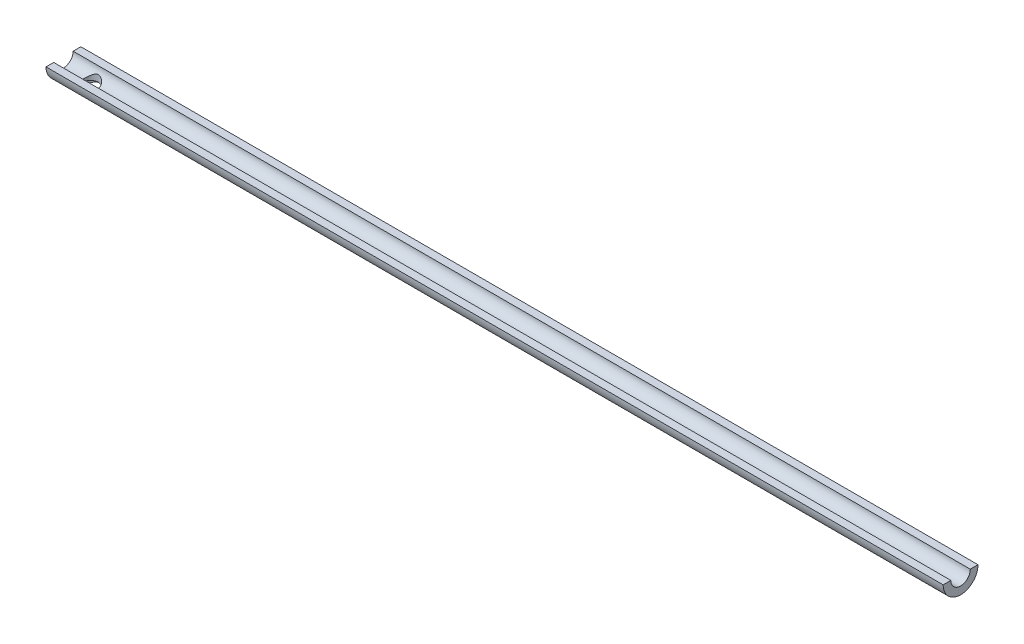
ISO-10303-21;
HEADER;
FILE_DESCRIPTION(('STEP AP214'),'2;1');
FILE_NAME('part.step','',(''),(''),'','','');
FILE_SCHEMA(('AUTOMOTIVE_DESIGN { 1 0 10303 214 1 1 1 1 }'));
ENDSEC;
DATA;
#1=APPLICATION_CONTEXT('core data for automotive mechanical design processes');
#2=APPLICATION_PROTOCOL_DEFINITION('international standard','automotive_design',2000,#1);
#3=PRODUCT_CONTEXT('',#1,'mechanical');
#4=PRODUCT('Part','Part','',(#3));
#5=PRODUCT_RELATED_PRODUCT_CATEGORY('part','',(#4));
#6=PRODUCT_DEFINITION_FORMATION('','',#4);
#7=PRODUCT_DEFINITION_CONTEXT('part definition',#1,'design');
#8=PRODUCT_DEFINITION('design','',#6,#7);
#9=PRODUCT_DEFINITION_SHAPE('','',#8);
#10=(LENGTH_UNIT() NAMED_UNIT(*) SI_UNIT(.MILLI.,.METRE.));
#11=(NAMED_UNIT(*) PLANE_ANGLE_UNIT() SI_UNIT($,.RADIAN.));
#12=(NAMED_UNIT(*) SI_UNIT($,.STERADIAN.) SOLID_ANGLE_UNIT());
#13=UNCERTAINTY_MEASURE_WITH_UNIT(LENGTH_MEASURE(1.E-05),#10,'distance_accuracy_value','');
#14=(GEOMETRIC_REPRESENTATION_CONTEXT(3) GLOBAL_UNCERTAINTY_ASSIGNED_CONTEXT((#13)) GLOBAL_UNIT_ASSIGNED_CONTEXT((#10,
#11,#12)) REPRESENTATION_CONTEXT('',''));
#15=CARTESIAN_POINT('',(0.,0.,0.));
#16=DIRECTION('',(0.,0.,1.));
#17=DIRECTION('',(1.,0.,0.));
#18=AXIS2_PLACEMENT_3D('',#15,#16,#17);
#19=CARTESIAN_POINT('',(735.584,19.05,0.));
#20=DIRECTION('',(-1.,0.,0.));
#21=DIRECTION('',(0.,0.,1.));
#22=AXIS2_PLACEMENT_3D('',#19,#20,#21);
#23=PLANE('',#22);
#24=CARTESIAN_POINT('',(735.584,19.05,-19.05));
#25=DIRECTION('',(-1.,0.,0.));
#26=DIRECTION('',(0.,0.,1.));
#27=AXIS2_PLACEMENT_3D('',#24,#25,#26);
#28=CIRCLE('',#27,14.2875);
#29=CARTESIAN_POINT('',(735.584,19.05,-33.3375));
#30=VERTEX_POINT('',#29);
#31=CARTESIAN_POINT('',(735.584,19.05,-4.7625));
#32=VERTEX_POINT('',#31);
#33=EDGE_CURVE('E61',#30,#32,#28,.T.);
#34=ORIENTED_EDGE('',*,*,#33,.F.);
#35=DIRECTION('',(0.,0.,-1.));
#36=VECTOR('',#35,1.);
#37=CARTESIAN_POINT('',(735.584,19.05,0.));
#38=LINE('',#37,#36);
#39=CARTESIAN_POINT('',(735.584,19.05,-27.0256));
#40=VERTEX_POINT('',#39);
#41=EDGE_CURVE('E104',#40,#30,#38,.T.);
#42=ORIENTED_EDGE('',*,*,#41,.F.);
#43=CARTESIAN_POINT('',(735.584,19.05,-19.05));
#44=DIRECTION('',(1.,0.,0.));
#45=DIRECTION('',(0.,0.,-1.));
#46=AXIS2_PLACEMENT_3D('',#43,#44,#45);
#47=CIRCLE('',#46,7.9756);
#48=CARTESIAN_POINT('',(735.584,19.05,-11.0744));
#49=VERTEX_POINT('',#48);
#50=EDGE_CURVE('E125',#49,#40,#47,.T.);
#51=ORIENTED_EDGE('',*,*,#50,.F.);
#52=EDGE_CURVE('E102',#32,#49,#38,.T.);
#53=ORIENTED_EDGE('',*,*,#52,.F.);
#54=EDGE_LOOP('',(#34,#42,#51,#53));
#55=FACE_BOUND('',#54,.T.);
#56=ADVANCED_FACE('F45',(#55),#23,.F.);
#57=CARTESIAN_POINT('',(0.,19.05,0.));
#58=DIRECTION('',(0.,-1.,0.));
#59=DIRECTION('',(0.,0.,-1.));
#60=AXIS2_PLACEMENT_3D('',#57,#58,#59);
#61=PLANE('',#60);
#62=DIRECTION('',(-1.,0.,0.));
#63=VECTOR('',#62,1.);
#64=CARTESIAN_POINT('',(735.584,19.05,-33.3375));
#65=LINE('',#64,#63);
#66=CARTESIAN_POINT('',(0.,19.05,-33.3375));
#67=VERTEX_POINT('',#66);
#68=EDGE_CURVE('E86',#67,#30,#65,.F.);
#69=ORIENTED_EDGE('',*,*,#68,.F.);
#70=DIRECTION('',(0.,0.,1.));
#71=VECTOR('',#70,1.);
#72=CARTESIAN_POINT('',(0.,19.05,0.));
#73=LINE('',#72,#71);
#74=CARTESIAN_POINT('',(0.,19.05,-27.0256));
#75=VERTEX_POINT('',#74);
#76=EDGE_CURVE('E108',#67,#75,#73,.T.);
#77=ORIENTED_EDGE('',*,*,#76,.T.);
#78=DIRECTION('',(1.,0.,0.));
#79=VECTOR('',#78,1.);
#80=CARTESIAN_POINT('',(0.,19.05,-27.0256));
#81=LINE('',#80,#79);
#82=EDGE_CURVE('E12',#75,#40,#81,.T.);
#83=ORIENTED_EDGE('',*,*,#82,.T.);
#84=ORIENTED_EDGE('',*,*,#41,.T.);
#85=EDGE_LOOP('',(#69,#77,#83,#84));
#86=FACE_BOUND('',#85,.T.);
#87=ADVANCED_FACE('F110',(#86),#61,.F.);
#88=DIRECTION('',(-1.,0.,0.));
#89=VECTOR('',#88,1.);
#90=CARTESIAN_POINT('',(735.584,19.05,-4.7625));
#91=LINE('',#90,#89);
#92=CARTESIAN_POINT('',(0.,19.05,-4.7625));
#93=VERTEX_POINT('',#92);
#94=EDGE_CURVE('E96',#32,#93,#91,.T.);
#95=ORIENTED_EDGE('',*,*,#94,.F.);
#96=ORIENTED_EDGE('',*,*,#52,.T.);
#97=DIRECTION('',(1.,0.,0.));
#98=VECTOR('',#97,1.);
#99=CARTESIAN_POINT('',(0.,19.05,-11.0744));
#100=LINE('',#99,#98);
#101=CARTESIAN_POINT('',(0.,19.05,-11.0744));
#102=VERTEX_POINT('',#101);
#103=EDGE_CURVE('E57',#49,#102,#100,.F.);
#104=ORIENTED_EDGE('',*,*,#103,.T.);
#105=EDGE_CURVE('E109',#102,#93,#73,.T.);
#106=ORIENTED_EDGE('',*,*,#105,.T.);
#107=EDGE_LOOP('',(#95,#96,#104,#106));
#108=FACE_BOUND('',#107,.T.);
#109=ADVANCED_FACE('F144',(#108),#61,.F.);
#110=CARTESIAN_POINT('',(22.225,8.89,-19.05));
#111=DIRECTION('',(0.,-1.,0.));
#112=DIRECTION('',(0.,0.,-1.));
#113=AXIS2_PLACEMENT_3D('',#110,#111,#112);
#114=CYLINDRICAL_SURFACE('',#113,8.128);
#115=CARTESIAN_POINT('',(22.225,8.89,-19.05));
#116=DIRECTION('',(0.,-1.,0.));
#117=DIRECTION('',(0.,0.,-1.));
#118=AXIS2_PLACEMENT_3D('',#115,#116,#117);
#119=CIRCLE('',#118,8.128);
#120=CARTESIAN_POINT('',(22.225,8.89,-27.178));
#121=VERTEX_POINT('',#120);
#122=EDGE_CURVE('E182',#121,#121,#119,.T.);
#123=ORIENTED_EDGE('',*,*,#122,.F.);
#124=EDGE_LOOP('',(#123));
#125=FACE_BOUND('',#124,.T.);
#126=CARTESIAN_POINT('',(22.225,7.29975437490772,-27.178));
#127=CARTESIAN_POINT('',(22.0180147532059,7.2997532803757,-27.1779992237774));
#128=CARTESIAN_POINT('',(21.8110182894372,7.29426483692695,-27.1700813911082));
#129=CARTESIAN_POINT('',(21.3987922198779,7.27254245588704,-27.1385418085654));
#130=CARTESIAN_POINT('',(21.1935627571081,7.25630765661839,-27.1149187993993));
#131=CARTESIAN_POINT('',(20.7863878615931,7.21374877782049,-27.0523271400779));
#132=CARTESIAN_POINT('',(20.5844447959058,7.18741773491488,-27.0133478982228));
#133=CARTESIAN_POINT('',(20.1853282556612,7.12567075075943,-26.920586092574));
#134=CARTESIAN_POINT('',(19.988157024114,7.09025062456957,-26.8667967088247));
#135=CARTESIAN_POINT('',(19.6012008031054,7.01185509724765,-26.745511165725));
#136=CARTESIAN_POINT('',(19.4113740403267,6.96893385173565,-26.6781127509178));
#137=CARTESIAN_POINT('',(19.0385167877706,6.8766974888775,-26.5300382259267));
#138=CARTESIAN_POINT('',(18.8554888516306,6.8273799997255,-26.4493571873782));
#139=CARTESIAN_POINT('',(18.4970035159903,6.72373604210493,-26.2753794395942));
#140=CARTESIAN_POINT('',(18.3215461204565,6.66940957101198,-26.1820827237488));
#141=CARTESIAN_POINT('',(17.9788353795059,6.55712322601149,-25.9835226420731));
#142=CARTESIAN_POINT('',(17.8115823141774,6.49916322821229,-25.8782588681046));
#143=CARTESIAN_POINT('',(17.2873582640215,6.30891765196363,-25.5210848460265));
#144=CARTESIAN_POINT('',(16.946984312011,6.17195023811273,-25.2464934731679));
#145=CARTESIAN_POINT('',(16.472669066792,5.96805720220681,-24.7965425661813));
#146=CARTESIAN_POINT('',(16.3205174293569,5.90030880154062,-24.6401003216129));
#147=CARTESIAN_POINT('',(16.0288266458558,5.76677681487287,-24.3149290275969));
#148=CARTESIAN_POINT('',(15.8892896853653,5.70099357066447,-24.1461978581212));
#149=CARTESIAN_POINT('',(15.6112113719546,5.56688965528202,-23.7807265060997));
#150=CARTESIAN_POINT('',(15.4740014746693,5.49891350337649,-23.5828450606214));
#151=CARTESIAN_POINT('',(15.2169626423935,5.36904365322446,-23.1743177307861));
#152=CARTESIAN_POINT('',(15.0971260526265,5.30714728009375,-22.963677526368));
#153=CARTESIAN_POINT('',(14.8760572788859,5.19119860561373,-22.5308687873104));
#154=CARTESIAN_POINT('',(14.7748183059184,5.13714344338009,-22.3087044976281));
#155=CARTESIAN_POINT('',(14.592178921927,5.03849332974293,-21.8543445193544));
#156=CARTESIAN_POINT('',(14.5107756478608,4.99389701319039,-21.6221502841663));
#157=CARTESIAN_POINT('',(14.375223971502,4.91902848766091,-21.170385845118));
#158=CARTESIAN_POINT('',(14.3193106352917,4.88784266792939,-20.9514960729174));
#159=CARTESIAN_POINT('',(14.2257583035214,4.83540767567716,-20.5086681999183));
#160=CARTESIAN_POINT('',(14.1881183305758,4.81415797170662,-20.2847303697953));
#161=CARTESIAN_POINT('',(14.1317025233993,4.78223228622229,-19.8338970737274));
#162=CARTESIAN_POINT('',(14.1129137486965,4.77154905138997,-19.6070037451223));
#163=CARTESIAN_POINT('',(14.0944574588793,4.76105556350154,-19.1521972210181));
#164=CARTESIAN_POINT('',(14.0947882780549,4.76124436326759,-18.9242841160921));
#165=CARTESIAN_POINT('',(14.1134480106352,4.77185216207865,-18.4950597861182));
#166=CARTESIAN_POINT('',(14.1297567730494,4.78112288849519,-18.2936283829412));
#167=CARTESIAN_POINT('',(14.1772302026522,4.80800272114614,-17.8930847861401));
#168=CARTESIAN_POINT('',(14.2083948904262,4.82561183893479,-17.6939725957299));
#169=CARTESIAN_POINT('',(14.285205100033,4.8687586086349,-17.2994481376164));
#170=CARTESIAN_POINT('',(14.330850422873,4.89429615159389,-17.1040358191084));
#171=CARTESIAN_POINT('',(14.4361090438978,4.95272437070963,-16.7181404779157));
#172=CARTESIAN_POINT('',(14.4957228984782,4.98561533976627,-16.5276576519185));
#173=CARTESIAN_POINT('',(14.6289037163109,5.058366444814,-16.151044574491));
#174=CARTESIAN_POINT('',(14.7025895729946,5.09828572021973,-15.9649678088723));
#175=CARTESIAN_POINT('',(14.8628859216692,5.18405516258062,-15.5998607105857));
#176=CARTESIAN_POINT('',(14.9495007436818,5.22990731581991,-15.420832764111));
#177=CARTESIAN_POINT('',(15.2276890928379,5.37500547802107,-14.8956302559676));
#178=CARTESIAN_POINT('',(15.4376919804277,5.48184115966405,-14.5610979019035));
#179=CARTESIAN_POINT('',(15.9273094610793,5.72039424455193,-13.8930550781077));
#180=CARTESIAN_POINT('',(16.2120962339968,5.85355865345796,-13.5638891046657));
#181=CARTESIAN_POINT('',(16.8300430009505,6.12341747384691,-12.9551675557189));
#182=CARTESIAN_POINT('',(17.1632609297996,6.26011594956813,-12.6756723006394));
#183=CARTESIAN_POINT('',(17.7123785400368,6.46431712151679,-12.285552451061));
#184=CARTESIAN_POINT('',(17.9135239179696,6.5352555712769,-12.1555659656631));
#185=CARTESIAN_POINT('',(18.3279364553059,6.67190988125253,-11.9131328407156));
#186=CARTESIAN_POINT('',(18.5412052632069,6.73762502829579,-11.8006885943137));
#187=CARTESIAN_POINT('',(18.9784190779849,6.86128936956866,-11.5946376821911));
#188=CARTESIAN_POINT('',(19.2023480558645,6.91924975339225,-11.5010037743509));
#189=CARTESIAN_POINT('',(19.6597889977331,7.02506144936678,-11.3335671871596));
#190=CARTESIAN_POINT('',(19.8932976168246,7.07291625477487,-11.2597576525893));
#191=CARTESIAN_POINT('',(20.3141247550129,7.14676227899167,-11.147531505603));
#192=CARTESIAN_POINT('',(20.4998869661831,7.17525064127314,-11.1048837500096));
#193=CARTESIAN_POINT('',(20.8749901106291,7.22391667287766,-11.032624119537));
#194=CARTESIAN_POINT('',(21.0643303425699,7.24409595356551,-11.0030097170471));
#195=CARTESIAN_POINT('',(21.4452238519753,7.27543715333412,-10.9572193397773));
#196=CARTESIAN_POINT('',(21.6367752842204,7.28660610746744,-10.9410328804927));
#197=CARTESIAN_POINT('',(22.0208703931804,7.29954872876364,-10.922289176426));
#198=CARTESIAN_POINT('',(22.2134140953366,7.30132215381884,-10.9197322828558));
#199=CARTESIAN_POINT('',(22.5981461721252,7.29540541837536,-10.9282890627355));
#200=CARTESIAN_POINT('',(22.7903343200902,7.28771051065841,-10.9394095937503));
#201=CARTESIAN_POINT('',(23.1728480072731,7.26313218458613,-10.9751705709717));
#202=CARTESIAN_POINT('',(23.3631735398583,7.24624873352351,-10.9998110653035));
#203=CARTESIAN_POINT('',(23.7407450063913,7.20388080940674,-11.062288437456));
#204=CARTESIAN_POINT('',(23.9279896141035,7.17839272894073,-11.1001308502822));
#205=CARTESIAN_POINT('',(24.2982642769525,7.11964973717565,-11.1885617223697));
#206=CARTESIAN_POINT('',(24.4812926013519,7.08639169667847,-11.2391553175666));
#207=CARTESIAN_POINT('',(24.844494847235,7.01264193152166,-11.3532904310791));
#208=CARTESIAN_POINT('',(25.0246000490354,6.97206122163712,-11.4169927594608));
#209=CARTESIAN_POINT('',(25.3787080656639,6.88510547664289,-11.5563533307756));
#210=CARTESIAN_POINT('',(25.5527088431555,6.8387285301769,-11.6320155197594));
#211=CARTESIAN_POINT('',(26.0645284851636,6.69267962655346,-11.8760720749144));
#212=CARTESIAN_POINT('',(26.3923325093595,6.58605365305769,-12.061589808659));
#213=CARTESIAN_POINT('',(27.0686900250849,6.34513197155075,-12.508338747979));
#214=CARTESIAN_POINT('',(27.4117498844502,6.20917303350306,-12.7770107658701));
#215=CARTESIAN_POINT('',(27.8909516798366,6.00582797521136,-13.2183070688705));
#216=CARTESIAN_POINT('',(28.0448883261136,5.9380953119018,-13.3719150091513));
#217=CARTESIAN_POINT('',(28.3403524753679,5.80430498736831,-13.6914386250406));
#218=CARTESIAN_POINT('',(28.4818779387584,5.73824760271373,-13.8573563153278));
#219=CARTESIAN_POINT('',(28.7648784244889,5.60301685551444,-14.2176239858584));
#220=CARTESIAN_POINT('',(28.9049937562794,5.53417096368468,-14.4131675097714));
#221=CARTESIAN_POINT('',(29.1680510426809,5.40224240655099,-14.8172109410428));
#222=CARTESIAN_POINT('',(29.2910003725608,5.33915727022872,-15.0257052282056));
#223=CARTESIAN_POINT('',(29.5185153802836,5.22053079179035,-15.4544625311531));
#224=CARTESIAN_POINT('',(29.623087585257,5.16498677284409,-15.6747213320632));
#225=CARTESIAN_POINT('',(29.8126114017301,5.06308715215838,-16.1255674144062));
#226=CARTESIAN_POINT('',(29.8975657204929,5.01673028272008,-16.356153265459));
#227=CARTESIAN_POINT('',(30.0405319279167,4.93803511449334,-16.8065627144206));
#228=CARTESIAN_POINT('',(30.1001807373834,4.90485955165364,-17.0257206954869));
#229=CARTESIAN_POINT('',(30.2010980032451,4.84842764573779,-17.4694910599292));
#230=CARTESIAN_POINT('',(30.2423673439576,4.82517082542945,-17.694103180334));
#231=CARTESIAN_POINT('',(30.3058771817978,4.78927905051082,-18.1466803103593));
#232=CARTESIAN_POINT('',(30.328131386229,4.7766364446235,-18.3746427840472));
#233=CARTESIAN_POINT('',(30.3533008556728,4.76233273321918,-18.8319685103891));
#234=CARTESIAN_POINT('',(30.3562179535954,4.76067058689532,-19.0613316282171));
#235=CARTESIAN_POINT('',(30.3434555646966,4.76792805827617,-19.4929113254883));
#236=CARTESIAN_POINT('',(30.329877594262,4.7756519084853,-19.6952143027216));
#237=CARTESIAN_POINT('',(30.2877260874705,4.79954313495614,-20.0977497224463));
#238=CARTESIAN_POINT('',(30.259152613769,4.81571047593858,-20.2979821735856));
#239=CARTESIAN_POINT('',(30.1873597538179,4.8561081377679,-20.6949623606104));
#240=CARTESIAN_POINT('',(30.1441407301919,4.88033825898019,-20.8917101826484));
#241=CARTESIAN_POINT('',(30.0435525296171,4.93630836593261,-21.2804571592908));
#242=CARTESIAN_POINT('',(29.9861828292883,4.96804862944265,-21.4724561379644));
#243=CARTESIAN_POINT('',(29.8577103118146,5.03844616022037,-21.8511049285758));
#244=CARTESIAN_POINT('',(29.7865700609654,5.07712226021264,-22.0377385298513));
#245=CARTESIAN_POINT('',(29.6313250934355,5.1605200799614,-22.4041579276078));
#246=CARTESIAN_POINT('',(29.547216049953,5.20524381678706,-22.5839414136153));
#247=CARTESIAN_POINT('',(29.2764762262614,5.34715934525449,-23.1116732419864));
#248=CARTESIAN_POINT('',(29.0713476266087,5.45214337546833,-23.448251074376));
#249=CARTESIAN_POINT('',(28.5924271313372,5.68721039405393,-24.1204134915682));
#250=CARTESIAN_POINT('',(28.3135686743286,5.81878358838055,-24.4518300479086));
#251=CARTESIAN_POINT('',(27.7075374404192,6.08649202465902,-25.066008590855));
#252=CARTESIAN_POINT('',(27.380307034293,6.22263255637928,-25.3487116591085));
#253=CARTESIAN_POINT('',(26.8397096345114,6.42731241551686,-25.7452001411438));
#254=CARTESIAN_POINT('',(26.6410517451605,6.49879995190781,-25.8779005695173));
#255=CARTESIAN_POINT('',(26.2314938118909,6.63697839661398,-26.1259932134789));
#256=CARTESIAN_POINT('',(26.0205920153576,6.70366861515832,-26.2413829426684));
#257=CARTESIAN_POINT('',(25.5879373800307,6.82973552688158,-26.4535817018082));
#258=CARTESIAN_POINT('',(25.3662003977546,6.88912248496211,-26.5504169199846));
#259=CARTESIAN_POINT('',(24.9129075625092,6.99824468480013,-26.7245307380687));
#260=CARTESIAN_POINT('',(24.6813552048321,7.04798332775522,-26.801816232523));
#261=CARTESIAN_POINT('',(24.2671813550624,7.1249023117823,-26.9194578131634));
#262=CARTESIAN_POINT('',(24.0862738513112,7.15462899667628,-26.9642247084879));
#263=CARTESIAN_POINT('',(23.7207562828793,7.20631583410354,-27.0413681658742));
#264=CARTESIAN_POINT('',(23.5361469383456,7.22827748203223,-27.073747113713));
#265=CARTESIAN_POINT('',(23.164458579354,7.26370874786635,-27.1257035236378));
#266=CARTESIAN_POINT('',(22.9773814513257,7.27718450749925,-27.1452902445796));
#267=CARTESIAN_POINT('',(22.6018727277906,7.2952082191966,-27.1714394195515));
#268=CARTESIAN_POINT('',(22.4134410124486,7.29975537137837,-27.1780007066792));
#269=CARTESIAN_POINT('',(22.225,7.29975437490772,-27.178));
#270=B_SPLINE_CURVE_WITH_KNOTS('',3,(#126,#127,#128,#129,#130,#131,#132,#133,#134,#135,#136,
#137,#138,#139,#140,#141,#142,#143,#144,#145,#146,#147,#148,#149,#150,#151,#152,#153,#154,#155,
#156,#157,#158,#159,#160,#161,#162,#163,#164,#165,#166,#167,#168,#169,#170,#171,#172,#173,#174,
#175,#176,#177,#178,#179,#180,#181,#182,#183,#184,#185,#186,#187,#188,#189,#190,#191,#192,#193,
#194,#195,#196,#197,#198,#199,#200,#201,#202,#203,#204,#205,#206,#207,#208,#209,#210,#211,#212,
#213,#214,#215,#216,#217,#218,#219,#220,#221,#222,#223,#224,#225,#226,#227,#228,#229,#230,#231,
#232,#233,#234,#235,#236,#237,#238,#239,#240,#241,#242,#243,#244,#245,#246,#247,#248,#249,#250,
#251,#252,#253,#254,#255,#256,#257,#258,#259,#260,#261,#262,#263,#264,#265,#266,#267,#268,#269),
.UNSPECIFIED.,.T.,.F.,(4,2,2,2,2,2,2,2,2,2,2,2,2,2,2,2,2,2,2,2,2,2,2,2,2,2,2,2,2,2,2,2,2,2,2,2,
2,2,2,2,2,2,2,2,2,2,2,2,2,2,2,2,2,2,2,2,2,2,2,2,2,2,2,2,2,2,2,2,2,2,2,4),(0.,0.620754127397335,
1.24155803489433,1.86279088308009,2.48431028401051,3.10151510056483,3.71894944213898,
4.33638410720971,4.95383983629193,6.32207699198678,7.0070909176564,7.69222329994257,
8.44188180863365,9.19120900314589,9.94026211248618,10.6892070409742,11.3724245891144,
12.0556055900344,12.7383172974123,13.4209695266473,14.0271565984417,14.6333445102122,
15.2395240921138,15.8457278235166,16.457300101753,17.069077662278,18.2918655983162,
19.6521467844397,21.0140687809612,21.7625974992275,22.5112282441642,23.2587668400916,
24.0060466052427,24.5835815681624,25.161004477988,25.737976111966,26.3149626135041,
26.8922385215696,27.4695164845053,28.0470367670997,28.624790036755,29.2101056428332,
29.7956147733005,30.9660989876605,32.329617069885,33.0123866851701,33.6952682936899,
34.4449625332793,35.1943336735009,35.943438114087,36.6924391166014,37.3800868041914,
38.0677014024412,38.7548199057505,39.4418732780968,40.0498584890229,40.6578411596363,
41.2658087777079,41.8737988855684,42.4834655652482,43.0933360910135,44.3122855860784,
45.6650948400749,47.0195289870142,47.7668485354288,48.5142753215082,49.2606392749048,
50.0067396420717,50.5723472476314,51.1378458687383,51.7029347339976,52.2680742212807),.UNSPECIFIED.);
#271=CARTESIAN_POINT('',(22.225,7.29975437490772,-27.178));
#272=VERTEX_POINT('',#271);
#273=EDGE_CURVE('E149',#272,#272,#270,.T.);
#274=ORIENTED_EDGE('',*,*,#273,.F.);
#275=EDGE_LOOP('',(#274));
#276=FACE_BOUND('',#275,.T.);
#277=ADVANCED_FACE('F132',(#125,#276),#114,.F.);
#278=CARTESIAN_POINT('',(22.225,19.05,-19.05));
#279=DIRECTION('',(0.,-1.,0.));
#280=DIRECTION('',(0.,0.,-1.));
#281=AXIS2_PLACEMENT_3D('',#278,#279,#280);
#282=CYLINDRICAL_SURFACE('',#281,6.3881);
#283=CARTESIAN_POINT('',(22.225,14.2748168883277,-25.4381));
#284=CARTESIAN_POINT('',(22.1052327505586,14.274814039197,-25.438098820239));
#285=CARTESIAN_POINT('',(21.9854232199568,14.2702884914255,-25.434722705346));
#286=CARTESIAN_POINT('',(21.7467943496114,14.2524098727596,-25.4212984158853));
#287=CARTESIAN_POINT('',(21.6279757318108,14.2390508531921,-25.4112457451437));
#288=CARTESIAN_POINT('',(21.391989247755,14.2041124463885,-25.3846703843907));
#289=CARTESIAN_POINT('',(21.2748262908106,14.1825124472511,-25.3681314684063));
#290=CARTESIAN_POINT('',(21.0430772688876,14.1320222996425,-25.3289098996023));
#291=CARTESIAN_POINT('',(20.9284929760754,14.1031272949173,-25.3062231534574));
#292=CARTESIAN_POINT('',(20.6628937152636,14.0279344976932,-25.2461362464194));
#293=CARTESIAN_POINT('',(20.5131367742915,13.9790835823443,-25.2063647831223));
#294=CARTESIAN_POINT('',(20.2197915539984,13.872691360835,-25.1171643565981));
#295=CARTESIAN_POINT('',(20.0762034876994,13.8151497548793,-25.0677350601958));
#296=CARTESIAN_POINT('',(19.7949137156383,13.6935489766235,-24.9597591825487));
#297=CARTESIAN_POINT('',(19.6572275618893,13.6294739278967,-24.9011901993955));
#298=CARTESIAN_POINT('',(19.38806000359,13.4969026275026,-24.775526517402));
#299=CARTESIAN_POINT('',(19.2565784396296,13.4284064895305,-24.7084320377651));
#300=CARTESIAN_POINT('',(18.9529411283808,13.2631960363066,-24.5401352813238));
#301=CARTESIAN_POINT('',(18.7833861837941,13.165280037829,-24.4354036163811));
#302=CARTESIAN_POINT('',(18.4554127661199,12.9676436433518,-24.2111534456428));
#303=CARTESIAN_POINT('',(18.2969983423859,12.8679226076486,-24.0916296063123));
#304=CARTESIAN_POINT('',(17.9916955279358,12.6695771350591,-23.8381399094518));
#305=CARTESIAN_POINT('',(17.844797916668,12.5709518763171,-23.7041858133124));
#306=CARTESIAN_POINT('',(17.5630287768574,12.377227219413,-23.4219090426535));
#307=CARTESIAN_POINT('',(17.4281532350785,12.2821266508703,-23.2735911978334));
#308=CARTESIAN_POINT('',(17.1968030315328,12.116024581123,-22.9935009714856));
#309=CARTESIAN_POINT('',(17.0980096988068,12.0439771142936,-22.8642589194477));
#310=CARTESIAN_POINT('',(16.9094822217991,11.9048579164068,-22.5968083574661));
#311=CARTESIAN_POINT('',(16.8197463220996,11.8377852218613,-22.458601593532));
#312=CARTESIAN_POINT('',(16.6502489019262,11.7098953788035,-22.1736860304114));
#313=CARTESIAN_POINT('',(16.5704756501414,11.6490708881213,-22.0269875342961));
#314=CARTESIAN_POINT('',(16.4217248912558,11.5348081874029,-21.7254560091128));
#315=CARTESIAN_POINT('',(16.3527455885979,11.4813687490478,-21.570624338722));
#316=CARTESIAN_POINT('',(16.236800327613,11.391030518359,-21.2792890376119));
#317=CARTESIAN_POINT('',(16.1880784876675,11.3528545766901,-21.1438784582453));
#318=CARTESIAN_POINT('',(16.0995036586541,11.2831904619205,-20.8685221342051));
#319=CARTESIAN_POINT('',(16.0596489769715,11.2517010125157,-20.7285772609168));
#320=CARTESIAN_POINT('',(15.9893577143691,11.1960106550603,-20.4449632728009));
#321=CARTESIAN_POINT('',(15.9589179593264,11.1718072906723,-20.3012954308672));
#322=CARTESIAN_POINT('',(15.9078996341911,11.1311684808592,-20.0111256332983));
#323=CARTESIAN_POINT('',(15.8873211817279,11.1147331280937,-19.8646236438781));
#324=CARTESIAN_POINT('',(15.8563091344789,11.0899428570188,-19.5693389342992));
#325=CARTESIAN_POINT('',(15.8459116143604,11.0816166729331,-19.4205499878728));
#326=CARTESIAN_POINT('',(15.8355683342188,11.0733339604599,-19.1223745389552));
#327=CARTESIAN_POINT('',(15.8356225943578,11.0733774482177,-18.9729880353119));
#328=CARTESIAN_POINT('',(15.8461821918462,11.08183330832,-18.674820165106));
#329=CARTESIAN_POINT('',(15.8566878632595,11.0902459481718,-18.5260388180391));
#330=CARTESIAN_POINT('',(15.8879682746795,11.1152500440522,-18.2302633786246));
#331=CARTESIAN_POINT('',(15.9087427748555,11.1318413090672,-18.0832692446184));
#332=CARTESIAN_POINT('',(15.9587988399754,11.17171120127,-17.8001806978062));
#333=CARTESIAN_POINT('',(15.9875478006364,11.194570357738,-17.663932376185));
#334=CARTESIAN_POINT('',(16.0535128731702,11.2468450892423,-17.394766708718));
#335=CARTESIAN_POINT('',(16.0907318592173,11.2762628897858,-17.2618505106137));
#336=CARTESIAN_POINT('',(16.2144072674728,11.373608880426,-16.8692305180578));
#337=CARTESIAN_POINT('',(16.3129176866269,11.4506583306336,-16.6154590497942));
#338=CARTESIAN_POINT('',(16.5487543799121,11.6327245816322,-16.104704906669));
#339=CARTESIAN_POINT('',(16.6889004366822,11.7397170423852,-15.849755763419));
#340=CARTESIAN_POINT('',(16.9979199787261,11.9708587232794,-15.3665496063558));
#341=CARTESIAN_POINT('',(17.1668093956242,12.0950174509934,-15.1383075145394));
#342=CARTESIAN_POINT('',(17.5670121213274,12.3810020543123,-14.665274929368));
#343=CARTESIAN_POINT('',(17.8040164577472,12.5453161145503,-14.4267751965018));
#344=CARTESIAN_POINT('',(18.1837107008651,12.794970708512,-14.0998748619976));
#345=CARTESIAN_POINT('',(18.3144433738575,12.8788011891895,-13.995965062543));
#346=CARTESIAN_POINT('',(18.5838879278762,13.0459289928987,-13.798522513847));
#347=CARTESIAN_POINT('',(18.7225988644655,13.1292263777442,-13.7049885401775));
#348=CARTESIAN_POINT('',(18.9945810952623,13.2857302297115,-13.5368040698004));
#349=CARTESIAN_POINT('',(19.1271442316493,13.359150887039,-13.4612053897186));
#350=CARTESIAN_POINT('',(19.3989101114831,13.5024049524905,-13.3189821428806));
#351=CARTESIAN_POINT('',(19.5381136329472,13.5722379382661,-13.2523586312096));
#352=CARTESIAN_POINT('',(19.8230448858232,13.7062186177797,-13.1286406029027));
#353=CARTESIAN_POINT('',(19.9687610275338,13.7703758495949,-13.0715299516153));
#354=CARTESIAN_POINT('',(20.2668341801483,13.8907208175741,-12.9673723099269));
#355=CARTESIAN_POINT('',(20.4191880812254,13.9469122343758,-12.92032066658));
#356=CARTESIAN_POINT('',(20.7912235461618,14.0683828350802,-12.8208690102389));
#357=CARTESIAN_POINT('',(21.0140304710439,14.1286869473467,-12.7735149467321));
#358=CARTESIAN_POINT('',(21.3550709422428,14.1975048821836,-12.7203624780865));
#359=CARTESIAN_POINT('',(21.4698259969392,14.216833239897,-12.7056278818068));
#360=CARTESIAN_POINT('',(21.7010015099083,14.2475153934693,-12.6823697504844));
#361=CARTESIAN_POINT('',(21.8174211522823,14.2588729681325,-12.6738432722132));
#362=CARTESIAN_POINT('',(22.0518034268537,14.2731181201431,-12.6631638607535));
#363=CARTESIAN_POINT('',(22.1697711544455,14.275952379488,-12.6610510477804));
#364=CARTESIAN_POINT('',(22.4055243717252,14.272859527311,-12.6633633503319));
#365=CARTESIAN_POINT('',(22.523309864435,14.2669325626669,-12.667788356253));
#366=CARTESIAN_POINT('',(22.7578335159747,14.2466033188336,-12.6830749223987));
#367=CARTESIAN_POINT('',(22.8745705150571,14.2321926057104,-12.6939428878268));
#368=CARTESIAN_POINT('',(23.1061001327548,14.1955559690321,-12.721880598897));
#369=CARTESIAN_POINT('',(23.2208916572662,14.173325791437,-12.738953720512));
#370=CARTESIAN_POINT('',(23.4763689472632,14.1155119007245,-12.7840060094082));
#371=CARTESIAN_POINT('',(23.6163197884937,14.0779768079834,-12.8136471467515));
#372=CARTESIAN_POINT('',(23.8914885447928,13.9940779011198,-12.8814709642971));
#373=CARTESIAN_POINT('',(24.0267024745981,13.9477068547341,-12.9196606460224));
#374=CARTESIAN_POINT('',(24.2923196201918,13.8479820640947,-13.0040527859047));
#375=CARTESIAN_POINT('',(24.4227106517279,13.7946120023126,-13.0502740534132));
#376=CARTESIAN_POINT('',(24.6782444374999,13.6827292792931,-13.1501501894327));
#377=CARTESIAN_POINT('',(24.8033887039598,13.6242181150877,-13.2038028965967));
#378=CARTESIAN_POINT('',(25.1052107630794,13.4756299814114,-13.3446216061781));
#379=CARTESIAN_POINT('',(25.2789862612766,13.3834582881012,-13.4358190301769));
#380=CARTESIAN_POINT('',(25.6158595113909,13.1950169831623,-13.632623988902));
#381=CARTESIAN_POINT('',(25.7789527938587,13.0987456837039,-13.7382374990531));
#382=CARTESIAN_POINT('',(26.0946198453451,12.9050183009142,-13.9635965218095));
#383=CARTESIAN_POINT('',(26.2471829686647,12.807561132448,-14.0833560134276));
#384=CARTESIAN_POINT('',(26.5413065650432,12.6141147392437,-14.3367225644051));
#385=CARTESIAN_POINT('',(26.6828687679256,12.5181252856313,-14.4703274389264));
#386=CARTESIAN_POINT('',(26.9564074532175,12.328486823226,-14.7533840791869));
#387=CARTESIAN_POINT('',(27.0882103425337,12.234893748223,-14.9030417320617));
#388=CARTESIAN_POINT('',(27.3388464398469,12.053837047129,-15.2163803190535));
#389=CARTESIAN_POINT('',(27.4576776089741,11.9663743853756,-15.3800634504718));
#390=CARTESIAN_POINT('',(27.6806361750933,11.800114304431,-15.7205626337706));
#391=CARTESIAN_POINT('',(27.7848030054089,11.7212937774841,-15.8973414355147));
#392=CARTESIAN_POINT('',(27.9770855754591,11.574371780693,-16.263596076572));
#393=CARTESIAN_POINT('',(28.065210382795,11.5062642584022,-16.4530646597339));
#394=CARTESIAN_POINT('',(28.1980367499377,11.4028819491454,-16.7804103597539));
#395=CARTESIAN_POINT('',(28.2475803737627,11.3640992374587,-16.9152387609548));
#396=CARTESIAN_POINT('',(28.3378678150898,11.2931484901818,-17.1894910725617));
#397=CARTESIAN_POINT('',(28.3786139262101,11.2609787306197,-17.3289137742256));
#398=CARTESIAN_POINT('',(28.4507449907862,11.2038678580281,-17.6115357425983));
#399=CARTESIAN_POINT('',(28.4821348986816,11.1789229193997,-17.7547329666805));
#400=CARTESIAN_POINT('',(28.535113997026,11.1367418140565,-18.0440626457928));
#401=CARTESIAN_POINT('',(28.5567028417334,11.1195059192857,-18.1901952041797));
#402=CARTESIAN_POINT('',(28.5897884243429,11.0930655453528,-18.4848850553982));
#403=CARTESIAN_POINT('',(28.6012469622067,11.083891467003,-18.6334493926056));
#404=CARTESIAN_POINT('',(28.6137360302897,11.0738914413023,-18.9312977313757));
#405=CARTESIAN_POINT('',(28.6147666013123,11.0730654612862,-19.08058173012));
#406=CARTESIAN_POINT('',(28.6063814203265,11.0797806612618,-19.3786739591682));
#407=CARTESIAN_POINT('',(28.5969650709103,11.0873223197574,-19.5274821617754));
#408=CARTESIAN_POINT('',(28.5678490540645,11.1106025567673,-19.8234327862726));
#409=CARTESIAN_POINT('',(28.5481496223914,11.1263409473581,-19.9705752462732));
#410=CARTESIAN_POINT('',(28.5001493876858,11.1645910125927,-20.2540929008347));
#411=CARTESIAN_POINT('',(28.4723807386124,11.1866829525395,-20.3906154464951));
#412=CARTESIAN_POINT('',(28.4083353913799,11.2374694305873,-20.6604153824373));
#413=CARTESIAN_POINT('',(28.3720557967089,11.2661662164385,-20.7936916508375));
#414=CARTESIAN_POINT('',(28.2511248753892,11.3614333901978,-21.1875016313292));
#415=CARTESIAN_POINT('',(28.1543473366223,11.4372080948184,-21.4422129056746));
#416=CARTESIAN_POINT('',(27.9223900905762,11.6165141721708,-21.9540971904978));
#417=CARTESIAN_POINT('',(27.7844988582947,11.7219562252637,-22.209345864024));
#418=CARTESIAN_POINT('',(27.4799868092597,11.9502027971903,-22.6934613706351));
#419=CARTESIAN_POINT('',(27.3133511064167,12.0730163063329,-22.9223144310665));
#420=CARTESIAN_POINT('',(26.9184725357559,12.3561083531647,-23.3965975233526));
#421=CARTESIAN_POINT('',(26.6845988963385,12.5189140644807,-23.6358569202021));
#422=CARTESIAN_POINT('',(26.3097726144167,12.7667649539992,-23.9642747646456));
#423=CARTESIAN_POINT('',(26.1806911019354,12.8500714788351,-24.0687552713237));
#424=CARTESIAN_POINT('',(25.9146267016791,13.0163526201005,-24.2674746070618));
#425=CARTESIAN_POINT('',(25.7776446538587,13.0993272708143,-24.3617145218011));
#426=CARTESIAN_POINT('',(25.5062384884342,13.2571050832276,-24.5331675293976));
#427=CARTESIAN_POINT('',(25.372370856074,13.332059569796,-24.6111237875191));
#428=CARTESIAN_POINT('',(25.0977922604518,13.4784825622508,-24.757812386486));
#429=CARTESIAN_POINT('',(24.9570803412751,13.5499505783875,-24.8265434338135));
#430=CARTESIAN_POINT('',(24.6688775014176,13.6872673422313,-24.9542419400898));
#431=CARTESIAN_POINT('',(24.5213962543452,13.7531237467057,-25.0132228094952));
#432=CARTESIAN_POINT('',(24.2195735877817,13.8768276750194,-25.120848164933));
#433=CARTESIAN_POINT('',(24.0652357284725,13.9346792924627,-25.1694979410872));
#434=CARTESIAN_POINT('',(23.6866299101477,14.0604493343227,-25.2728324464126));
#435=CARTESIAN_POINT('',(23.4590175240415,14.1231832380111,-25.3221880751248));
#436=CARTESIAN_POINT('',(23.1105246908656,14.1947371974138,-25.3775200567966));
#437=CARTESIAN_POINT('',(22.9933337449957,14.2148195102463,-25.3928395467874));
#438=CARTESIAN_POINT('',(22.7571877638756,14.2466717278377,-25.4169964197543));
#439=CARTESIAN_POINT('',(22.638234014565,14.2584474141683,-25.425838311429));
#440=CARTESIAN_POINT('',(22.4700071475055,14.2687857455437,-25.4335879574572));
#441=CARTESIAN_POINT('',(22.4210546397125,14.2710447319264,-25.4352788171575));
#442=CARTESIAN_POINT('',(22.3230704575174,14.274060991964,-25.4375351589094));
#443=CARTESIAN_POINT('',(22.2740387729727,14.274818054906,-25.4381004830538));
#444=CARTESIAN_POINT('',(22.225,14.2748168883277,-25.4381));
#445=B_SPLINE_CURVE_WITH_KNOTS('',3,(#283,#284,#285,#286,#287,#288,#289,#290,#291,#292,#293,
#294,#295,#296,#297,#298,#299,#300,#301,#302,#303,#304,#305,#306,#307,#308,#309,#310,#311,#312,
#313,#314,#315,#316,#317,#318,#319,#320,#321,#322,#323,#324,#325,#326,#327,#328,#329,#330,#331,
#332,#333,#334,#335,#336,#337,#338,#339,#340,#341,#342,#343,#344,#345,#346,#347,#348,#349,#350,
#351,#352,#353,#354,#355,#356,#357,#358,#359,#360,#361,#362,#363,#364,#365,#366,#367,#368,#369,
#370,#371,#372,#373,#374,#375,#376,#377,#378,#379,#380,#381,#382,#383,#384,#385,#386,#387,#388,
#389,#390,#391,#392,#393,#394,#395,#396,#397,#398,#399,#400,#401,#402,#403,#404,#405,#406,#407,
#408,#409,#410,#411,#412,#413,#414,#415,#416,#417,#418,#419,#420,#421,#422,#423,#424,#425,#426,
#427,#428,#429,#430,#431,#432,#433,#434,#435,#436,#437,#438,#439,#440,#441,#442,#443,#444),
.UNSPECIFIED.,.T.,.F.,(4,2,2,2,2,2,2,2,2,2,2,2,2,2,2,2,2,2,2,2,2,2,2,2,2,2,2,2,2,2,2,2,2,2,2,2,
2,2,2,2,2,2,2,2,2,2,2,2,2,2,2,2,2,2,2,2,2,2,2,2,2,2,2,2,2,2,2,2,2,2,2,2,2,2,2,2,2,2,2,2,4),(0.,
0.359245179244354,0.718732529577265,1.07912496834835,1.43975795434911,1.92638299180333,
2.41302481977301,2.90087873346032,3.3887201062364,4.05400647552527,4.71953342627139,
5.38452198518502,6.04928771807205,6.58256105043039,7.11573083001809,7.64826674527233,
8.18071397959592,8.62692497788757,9.07305072761334,9.51902590735534,9.96500640672432,
10.4125615160274,10.8601174886853,11.3076877672642,11.755247593237,12.1781139864735,
12.6011240875218,13.4465463608487,14.3731857987963,15.300340529297,16.41865715381,
16.978888040889,17.5390527458781,18.0467296558574,18.5544661943329,19.0613325990118,
19.5679640352548,20.2717814497553,20.6233128366701,20.9746774561174,21.3282355284933,
21.6817876737031,22.0356918900225,22.3897889401537,22.8327911014942,23.2761574316288,
23.7205764409554,24.1648664665765,24.8144149542988,25.4642335001755,26.1146996531555,
26.7650633167047,27.4250861772609,28.0852126300074,28.7435285922788,29.4014712843747,
29.8474041775792,30.2932206699093,30.7388006655533,31.1843963782243,31.6316652929727,
32.0789324576128,32.5262252005765,32.9735076890773,33.3962109197098,33.8190582172625,
34.6641558493559,35.5869061096163,36.5101356832614,37.6220449975749,38.1790804018281,
38.7360566929923,39.2519534995187,39.7679225673892,40.2831759547696,40.7981648627619,
41.5185079170742,41.8777735707034,42.2367889211431,42.383861445691,42.5309546023652),.UNSPECIFIED.);
#446=CARTESIAN_POINT('',(22.225,14.2748168883277,-25.4381));
#447=VERTEX_POINT('',#446);
#448=EDGE_CURVE('E114',#447,#447,#445,.T.);
#449=ORIENTED_EDGE('',*,*,#448,.T.);
#450=EDGE_LOOP('',(#449));
#451=FACE_BOUND('',#450,.T.);
#452=CARTESIAN_POINT('',(22.225,8.89,-19.05));
#453=DIRECTION('',(0.,-1.,0.));
#454=DIRECTION('',(0.,0.,-1.));
#455=AXIS2_PLACEMENT_3D('',#452,#453,#454);
#456=CIRCLE('',#455,6.3881);
#457=CARTESIAN_POINT('',(22.225,8.89,-25.4381));
#458=VERTEX_POINT('',#457);
#459=EDGE_CURVE('E124',#458,#458,#456,.T.);
#460=ORIENTED_EDGE('',*,*,#459,.T.);
#461=EDGE_LOOP('',(#460));
#462=FACE_BOUND('',#461,.T.);
#463=ADVANCED_FACE('F130',(#451,#462),#282,.F.);
#464=CARTESIAN_POINT('',(0.,19.05,-19.05));
#465=DIRECTION('',(1.,0.,0.));
#466=DIRECTION('',(0.,0.,-1.));
#467=AXIS2_PLACEMENT_3D('',#464,#465,#466);
#468=CYLINDRICAL_SURFACE('',#467,7.9756);
#469=CARTESIAN_POINT('',(0.,19.05,-19.05));
#470=DIRECTION('',(1.,0.,0.));
#471=DIRECTION('',(0.,0.,-1.));
#472=AXIS2_PLACEMENT_3D('',#469,#470,#471);
#473=CIRCLE('',#472,7.9756);
#474=EDGE_CURVE('E75',#102,#75,#473,.T.);
#475=ORIENTED_EDGE('',*,*,#474,.F.);
#476=ORIENTED_EDGE('',*,*,#103,.F.);
#477=ORIENTED_EDGE('',*,*,#50,.T.);
#478=ORIENTED_EDGE('',*,*,#82,.F.);
#479=EDGE_LOOP('',(#475,#476,#477,#478));
#480=FACE_BOUND('',#479,.T.);
#481=ORIENTED_EDGE('',*,*,#448,.F.);
#482=EDGE_LOOP('',(#481));
#483=FACE_BOUND('',#482,.T.);
#484=ADVANCED_FACE('F121',(#480,#483),#468,.F.);
#485=CARTESIAN_POINT('',(0.,19.05,0.));
#486=DIRECTION('',(1.,0.,0.));
#487=DIRECTION('',(0.,0.,-1.));
#488=AXIS2_PLACEMENT_3D('',#485,#486,#487);
#489=PLANE('',#488);
#490=ORIENTED_EDGE('',*,*,#76,.F.);
#491=CARTESIAN_POINT('',(0.,19.05,-19.05));
#492=DIRECTION('',(-1.,0.,0.));
#493=DIRECTION('',(0.,0.,1.));
#494=AXIS2_PLACEMENT_3D('',#491,#492,#493);
#495=CIRCLE('',#494,14.2875);
#496=EDGE_CURVE('E91',#67,#93,#495,.T.);
#497=ORIENTED_EDGE('',*,*,#496,.T.);
#498=ORIENTED_EDGE('',*,*,#105,.F.);
#499=ORIENTED_EDGE('',*,*,#474,.T.);
#500=EDGE_LOOP('',(#490,#497,#498,#499));
#501=FACE_BOUND('',#500,.T.);
#502=ADVANCED_FACE('F42',(#501),#489,.F.);
#503=CARTESIAN_POINT('',(22.225,8.89,-19.05));
#504=DIRECTION('',(0.,-1.,0.));
#505=DIRECTION('',(0.,0.,-1.));
#506=AXIS2_PLACEMENT_3D('',#503,#504,#505);
#507=PLANE('',#506);
#508=ORIENTED_EDGE('',*,*,#459,.F.);
#509=EDGE_LOOP('',(#508));
#510=FACE_BOUND('',#509,.T.);
#511=ORIENTED_EDGE('',*,*,#122,.T.);
#512=EDGE_LOOP('',(#511));
#513=FACE_BOUND('',#512,.T.);
#514=ADVANCED_FACE('F147',(#510,#513),#507,.T.);
#515=CARTESIAN_POINT('',(735.584,19.05,-19.05));
#516=DIRECTION('',(-1.,0.,0.));
#517=DIRECTION('',(0.,0.,1.));
#518=AXIS2_PLACEMENT_3D('',#515,#516,#517);
#519=CYLINDRICAL_SURFACE('',#518,14.2875);
#520=ORIENTED_EDGE('',*,*,#273,.T.);
#521=EDGE_LOOP('',(#520));
#522=FACE_BOUND('',#521,.T.);
#523=CARTESIAN_POINT('',(713.359,7.29975437490781,-27.1780000000001));
#524=CARTESIAN_POINT('',(713.152014753206,7.29975328037578,-27.1779992237775));
#525=CARTESIAN_POINT('',(712.945018289437,7.29426483692703,-27.1700813911084));
#526=CARTESIAN_POINT('',(712.532792219878,7.27254245588712,-27.1385418085655));
#527=CARTESIAN_POINT('',(712.327562757108,7.25630765661847,-27.1149187993994));
#528=CARTESIAN_POINT('',(711.920387861593,7.21374877782057,-27.052327140078));
#529=CARTESIAN_POINT('',(711.718444795906,7.18741773491497,-27.0133478982229));
#530=CARTESIAN_POINT('',(711.319328255661,7.12567075075952,-26.9205860925741));
#531=CARTESIAN_POINT('',(711.122157024114,7.09025062456965,-26.8667967088249));
#532=CARTESIAN_POINT('',(710.735200803105,7.01185509724774,-26.7455111657252));
#533=CARTESIAN_POINT('',(710.545374040327,6.96893385173574,-26.6781127509179));
#534=CARTESIAN_POINT('',(710.172516787771,6.8766974888776,-26.5300382259269));
#535=CARTESIAN_POINT('',(709.989488851631,6.8273799997256,-26.4493571873784));
#536=CARTESIAN_POINT('',(709.631003515991,6.72373604210504,-26.2753794395943));
#537=CARTESIAN_POINT('',(709.455546120457,6.6694095710121,-26.1820827237491));
#538=CARTESIAN_POINT('',(709.112835379506,6.5571232260116,-25.9835226420733));
#539=CARTESIAN_POINT('',(708.945582314177,6.49916322821239,-25.8782588681048));
#540=CARTESIAN_POINT('',(708.421358264022,6.3089176519637,-25.5210848460266));
#541=CARTESIAN_POINT('',(708.080984312011,6.17195023811281,-25.2464934731681));
#542=CARTESIAN_POINT('',(707.606669066792,5.96805720220688,-24.7965425661814));
#543=CARTESIAN_POINT('',(707.454517429357,5.90030880154068,-24.6401003216131));
#544=CARTESIAN_POINT('',(707.162826645856,5.76677681487292,-24.314929027597));
#545=CARTESIAN_POINT('',(707.023289685365,5.70099357066451,-24.1461978581213));
#546=CARTESIAN_POINT('',(706.745211371955,5.56688965528206,-23.7807265060998));
#547=CARTESIAN_POINT('',(706.608001474669,5.49891350337654,-23.5828450606215));
#548=CARTESIAN_POINT('',(706.350962642393,5.3690436532245,-23.1743177307863));
#549=CARTESIAN_POINT('',(706.231126052626,5.30714728009379,-22.9636775263681));
#550=CARTESIAN_POINT('',(706.010057278886,5.19119860561376,-22.5308687873105));
#551=CARTESIAN_POINT('',(705.908818305918,5.13714344338011,-22.3087044976282));
#552=CARTESIAN_POINT('',(705.726178921927,5.03849332974295,-21.8543445193545));
#553=CARTESIAN_POINT('',(705.644775647861,4.99389701319041,-21.6221502841664));
#554=CARTESIAN_POINT('',(705.509223971502,4.91902848766093,-21.1703858451181));
#555=CARTESIAN_POINT('',(705.453310635292,4.8878426679294,-20.9514960729175));
#556=CARTESIAN_POINT('',(705.359758303521,4.83540767567718,-20.5086681999184));
#557=CARTESIAN_POINT('',(705.322118330576,4.81415797170663,-20.2847303697954));
#558=CARTESIAN_POINT('',(705.265702523399,4.78223228622229,-19.8338970737274));
#559=CARTESIAN_POINT('',(705.246913748696,4.77154905138997,-19.6070037451224));
#560=CARTESIAN_POINT('',(705.228457458879,4.76105556350154,-19.1521972210181));
#561=CARTESIAN_POINT('',(705.228788278055,4.76124436326759,-18.9242841160922));
#562=CARTESIAN_POINT('',(705.247448010635,4.77185216207865,-18.4950597861182));
#563=CARTESIAN_POINT('',(705.263756773049,4.78112288849519,-18.2936283829412));
#564=CARTESIAN_POINT('',(705.311230202652,4.80800272114614,-17.8930847861401));
#565=CARTESIAN_POINT('',(705.342394890426,4.8256118389348,-17.6939725957299));
#566=CARTESIAN_POINT('',(705.419205100033,4.8687586086349,-17.2994481376163));
#567=CARTESIAN_POINT('',(705.464850422873,4.89429615159389,-17.1040358191084));
#568=CARTESIAN_POINT('',(705.570109043898,4.95272437070964,-16.7181404779157));
#569=CARTESIAN_POINT('',(705.629722898478,4.98561533976628,-16.5276576519185));
#570=CARTESIAN_POINT('',(705.762903716311,5.05836644481401,-16.1510445744909));
#571=CARTESIAN_POINT('',(705.836589572995,5.09828572021975,-15.9649678088722));
#572=CARTESIAN_POINT('',(705.996885921669,5.18405516258064,-15.5998607105856));
#573=CARTESIAN_POINT('',(706.083500743682,5.22990731581994,-15.4208327641109));
#574=CARTESIAN_POINT('',(706.361689092838,5.37500547802109,-14.8956302559675));
#575=CARTESIAN_POINT('',(706.571691980428,5.48184115966408,-14.5610979019034));
#576=CARTESIAN_POINT('',(707.061309461079,5.72039424455196,-13.8930550781076));
#577=CARTESIAN_POINT('',(707.346096233997,5.85355865345799,-13.5638891046656));
#578=CARTESIAN_POINT('',(707.96404300095,6.12341747384696,-12.9551675557188));
#579=CARTESIAN_POINT('',(708.2972609298,6.26011594956818,-12.6756723006393));
#580=CARTESIAN_POINT('',(708.846378540037,6.46431712151684,-12.2855524510609));
#581=CARTESIAN_POINT('',(709.04752391797,6.53525557127695,-12.155565965663));
#582=CARTESIAN_POINT('',(709.461936455306,6.6719098812526,-11.9131328407155));
#583=CARTESIAN_POINT('',(709.675205263207,6.73762502829586,-11.8006885943136));
#584=CARTESIAN_POINT('',(710.112419077985,6.86128936956874,-11.594637682191));
#585=CARTESIAN_POINT('',(710.336348055864,6.91924975339234,-11.5010037743508));
#586=CARTESIAN_POINT('',(710.793788997733,7.02506144936687,-11.3335671871594));
#587=CARTESIAN_POINT('',(711.027297616825,7.07291625477495,-11.2597576525891));
#588=CARTESIAN_POINT('',(711.448124755013,7.14676227899177,-11.1475315056029));
#589=CARTESIAN_POINT('',(711.633886966183,7.17525064127324,-11.1048837500094));
#590=CARTESIAN_POINT('',(712.008990110629,7.22391667287776,-11.0326241195368));
#591=CARTESIAN_POINT('',(712.19833034257,7.24409595356562,-11.0030097170469));
#592=CARTESIAN_POINT('',(712.579223851975,7.27543715333423,-10.9572193397771));
#593=CARTESIAN_POINT('',(712.77077528422,7.28660610746755,-10.9410328804925));
#594=CARTESIAN_POINT('',(713.154870393181,7.29954872876375,-10.9222891764258));
#595=CARTESIAN_POINT('',(713.347414095337,7.30132215381895,-10.9197322828557));
#596=CARTESIAN_POINT('',(713.732146172125,7.29540541837546,-10.9282890627353));
#597=CARTESIAN_POINT('',(713.92433432009,7.28771051065851,-10.9394095937502));
#598=CARTESIAN_POINT('',(714.306848007273,7.26313218458623,-10.9751705709715));
#599=CARTESIAN_POINT('',(714.497173539858,7.2462487335236,-10.9998110653034));
#600=CARTESIAN_POINT('',(714.874745006391,7.20388080940683,-11.0622884374558));
#601=CARTESIAN_POINT('',(715.061989614104,7.1783927289408,-11.1001308502821));
#602=CARTESIAN_POINT('',(715.432264276953,7.11964973717572,-11.1885617223696));
#603=CARTESIAN_POINT('',(715.615292601352,7.08639169667854,-11.2391553175665));
#604=CARTESIAN_POINT('',(715.978494847235,7.01264193152173,-11.353290431079));
#605=CARTESIAN_POINT('',(716.158600049036,6.97206122163719,-11.4169927594606));
#606=CARTESIAN_POINT('',(716.512708065664,6.88510547664295,-11.5563533307755));
#607=CARTESIAN_POINT('',(716.686708843156,6.83872853017694,-11.6320155197594));
#608=CARTESIAN_POINT('',(717.198528485164,6.6926796265535,-11.8760720749143));
#609=CARTESIAN_POINT('',(717.52633250936,6.58605365305773,-12.0615898086589));
#610=CARTESIAN_POINT('',(718.202690025085,6.34513197155077,-12.508338747979));
#611=CARTESIAN_POINT('',(718.54574988445,6.20917303350306,-12.7770107658701));
#612=CARTESIAN_POINT('',(719.024951679837,6.00582797521135,-13.2183070688705));
#613=CARTESIAN_POINT('',(719.178888326114,5.93809531190179,-13.3719150091513));
#614=CARTESIAN_POINT('',(719.474352475368,5.8043049873683,-13.6914386250406));
#615=CARTESIAN_POINT('',(719.615877938759,5.73824760271373,-13.8573563153278));
#616=CARTESIAN_POINT('',(719.898878424489,5.60301685551444,-14.2176239858584));
#617=CARTESIAN_POINT('',(720.03899375628,5.53417096368467,-14.4131675097714));
#618=CARTESIAN_POINT('',(720.302051042681,5.40224240655097,-14.8172109410429));
#619=CARTESIAN_POINT('',(720.425000372561,5.33915727022871,-15.0257052282056));
#620=CARTESIAN_POINT('',(720.652515380284,5.22053079179034,-15.4544625311532));
#621=CARTESIAN_POINT('',(720.757087585257,5.16498677284408,-15.6747213320633));
#622=CARTESIAN_POINT('',(720.94661140173,5.06308715215836,-16.1255674144062));
#623=CARTESIAN_POINT('',(721.031565720493,5.01673028272007,-16.356153265459));
#624=CARTESIAN_POINT('',(721.174531927917,4.93803511449332,-16.8065627144206));
#625=CARTESIAN_POINT('',(721.234180737384,4.90485955165363,-17.025720695487));
#626=CARTESIAN_POINT('',(721.335098003245,4.84842764573778,-17.4694910599293));
#627=CARTESIAN_POINT('',(721.376367343958,4.82517082542944,-17.6941031803341));
#628=CARTESIAN_POINT('',(721.439877181798,4.78927905051081,-18.1466803103594));
#629=CARTESIAN_POINT('',(721.462131386229,4.7766364446235,-18.3746427840474));
#630=CARTESIAN_POINT('',(721.487300855673,4.76233273321917,-18.8319685103893));
#631=CARTESIAN_POINT('',(721.490217953596,4.76067058689532,-19.0613316282172));
#632=CARTESIAN_POINT('',(721.477455564697,4.76792805827618,-19.4929113254885));
#633=CARTESIAN_POINT('',(721.463877594262,4.77565190848531,-19.6952143027217));
#634=CARTESIAN_POINT('',(721.421726087471,4.79954313495616,-20.0977497224465));
#635=CARTESIAN_POINT('',(721.393152613769,4.8157104759386,-20.2979821735857));
#636=CARTESIAN_POINT('',(721.321359753818,4.85610813776791,-20.6949623606105));
#637=CARTESIAN_POINT('',(721.278140730192,4.8803382589802,-20.8917101826485));
#638=CARTESIAN_POINT('',(721.177552529617,4.93630836593263,-21.280457159291));
#639=CARTESIAN_POINT('',(721.120182829289,4.96804862944268,-21.4724561379645));
#640=CARTESIAN_POINT('',(720.991710311815,5.0384461602204,-21.851104928576));
#641=CARTESIAN_POINT('',(720.920570060966,5.07712226021267,-22.0377385298515));
#642=CARTESIAN_POINT('',(720.765325093436,5.16052007996143,-22.4041579276079));
#643=CARTESIAN_POINT('',(720.681216049953,5.2052438167871,-22.5839414136155));
#644=CARTESIAN_POINT('',(720.410476226261,5.34715934525453,-23.1116732419865));
#645=CARTESIAN_POINT('',(720.205347626609,5.45214337546838,-23.4482510743762));
#646=CARTESIAN_POINT('',(719.726427131337,5.68721039405399,-24.1204134915684));
#647=CARTESIAN_POINT('',(719.447568674329,5.81878358838062,-24.4518300479088));
#648=CARTESIAN_POINT('',(718.841537440419,6.08649202465909,-25.0660085908552));
#649=CARTESIAN_POINT('',(718.514307034293,6.22263255637935,-25.3487116591086));
#650=CARTESIAN_POINT('',(717.973709634511,6.42731241551695,-25.7452001411439));
#651=CARTESIAN_POINT('',(717.77505174516,6.49879995190793,-25.8779005695175));
#652=CARTESIAN_POINT('',(717.365493811891,6.63697839661411,-26.1259932134792));
#653=CARTESIAN_POINT('',(717.154592015357,6.70366861515845,-26.2413829426686));
#654=CARTESIAN_POINT('',(716.721937380031,6.82973552688169,-26.4535817018084));
#655=CARTESIAN_POINT('',(716.500200397754,6.88912248496223,-26.5504169199848));
#656=CARTESIAN_POINT('',(716.046907562509,6.99824468480024,-26.7245307380689));
#657=CARTESIAN_POINT('',(715.815355204832,7.04798332775533,-26.8018162325232));
#658=CARTESIAN_POINT('',(715.401181355062,7.1249023117824,-26.9194578131636));
#659=CARTESIAN_POINT('',(715.220273851311,7.15462899667639,-26.9642247084881));
#660=CARTESIAN_POINT('',(714.854756282879,7.20631583410364,-27.0413681658744));
#661=CARTESIAN_POINT('',(714.670146938346,7.22827748203233,-27.0737471137132));
#662=CARTESIAN_POINT('',(714.298458579354,7.26370874786644,-27.125703523638));
#663=CARTESIAN_POINT('',(714.111381451326,7.27718450749934,-27.1452902445797));
#664=CARTESIAN_POINT('',(713.735872727791,7.29520821919669,-27.1714394195516));
#665=CARTESIAN_POINT('',(713.547441012449,7.29975537137845,-27.1780007066794));
#666=CARTESIAN_POINT('',(713.359,7.29975437490781,-27.1780000000001));
#667=B_SPLINE_CURVE_WITH_KNOTS('',3,(#523,#524,#525,#526,#527,#528,#529,#530,#531,#532,#533,
#534,#535,#536,#537,#538,#539,#540,#541,#542,#543,#544,#545,#546,#547,#548,#549,#550,#551,#552,
#553,#554,#555,#556,#557,#558,#559,#560,#561,#562,#563,#564,#565,#566,#567,#568,#569,#570,#571,
#572,#573,#574,#575,#576,#577,#578,#579,#580,#581,#582,#583,#584,#585,#586,#587,#588,#589,#590,
#591,#592,#593,#594,#595,#596,#597,#598,#599,#600,#601,#602,#603,#604,#605,#606,#607,#608,#609,
#610,#611,#612,#613,#614,#615,#616,#617,#618,#619,#620,#621,#622,#623,#624,#625,#626,#627,#628,
#629,#630,#631,#632,#633,#634,#635,#636,#637,#638,#639,#640,#641,#642,#643,#644,#645,#646,#647,
#648,#649,#650,#651,#652,#653,#654,#655,#656,#657,#658,#659,#660,#661,#662,#663,#664,#665,#666),
.UNSPECIFIED.,.T.,.F.,(4,2,2,2,2,2,2,2,2,2,2,2,2,2,2,2,2,2,2,2,2,2,2,2,2,2,2,2,2,2,2,2,2,2,2,2,
2,2,2,2,2,2,2,2,2,2,2,2,2,2,2,2,2,2,2,2,2,2,2,2,2,2,2,2,2,2,2,2,2,2,2,4),(0.,0.620754127397363,
1.24155803489431,1.86279088308009,2.48431028401053,3.10151510056485,3.71894944213881,
4.33638410720959,4.95383983629192,6.3220769919868,7.00709091765644,7.69222329994263,
8.44188180863375,9.19120900314594,9.94026211248627,10.6892070409743,11.3724245891145,
12.0556055900346,12.7383172974125,13.4209695266475,14.0271565984419,14.6333445102124,
15.239524092114,15.8457278235169,16.4573001017533,17.0690776622783,18.2918655983166,
19.65214678444,21.0140687809615,21.7625974992278,22.5112282441646,23.258766840092,
24.0060466052431,24.5835815681629,25.1610044779885,25.7379761119666,26.3149626135046,
26.89223852157,27.4695164845059,28.0470367671003,28.6247900367557,29.2101056428338,
29.7956147733011,30.9660989876612,32.3296170698858,33.0123866851709,33.6952682936907,
34.4449625332801,35.1943336735017,35.9434381140878,36.6924391166022,37.3800868041922,
38.067701402442,38.7548199057514,39.4418732780977,40.0498584890238,40.6578411596372,
41.2658087777087,41.8737988855693,42.4834655652491,43.0933360910144,44.3122855860794,
45.6650948400758,47.0195289870151,47.76684853543,48.5142753215093,49.2606392749059,
50.0067396420728,50.5723472476324,51.1378458687392,51.7029347339984,52.2680742212816),.UNSPECIFIED.);
#668=CARTESIAN_POINT('',(713.359,7.29975437490781,-27.1780000000001));
#669=VERTEX_POINT('',#668);
#670=EDGE_CURVE('E46',#669,#669,#667,.T.);
#671=ORIENTED_EDGE('',*,*,#670,.T.);
#672=EDGE_LOOP('',(#671));
#673=FACE_BOUND('',#672,.T.);
#674=ORIENTED_EDGE('',*,*,#68,.T.);
#675=ORIENTED_EDGE('',*,*,#33,.T.);
#676=ORIENTED_EDGE('',*,*,#94,.T.);
#677=ORIENTED_EDGE('',*,*,#496,.F.);
#678=EDGE_LOOP('',(#674,#675,#676,#677));
#679=FACE_BOUND('',#678,.T.);
#680=ADVANCED_FACE('F93',(#522,#673,#679),#519,.T.);
#681=CARTESIAN_POINT('',(713.359,8.89,-19.05));
#682=DIRECTION('',(0.,1.,0.));
#683=DIRECTION('',(0.,0.,1.));
#684=AXIS2_PLACEMENT_3D('',#681,#682,#683);
#685=PLANE('',#684);
#686=CARTESIAN_POINT('',(713.359,8.89,-19.05));
#687=DIRECTION('',(0.,-1.,0.));
#688=DIRECTION('',(0.,0.,1.));
#689=AXIS2_PLACEMENT_3D('',#686,#687,#688);
#690=CIRCLE('',#689,8.12800000000014);
#691=CARTESIAN_POINT('',(713.359,8.89,-10.9219999999998));
#692=VERTEX_POINT('',#691);
#693=EDGE_CURVE('E97',#692,#692,#690,.T.);
#694=ORIENTED_EDGE('',*,*,#693,.T.);
#695=EDGE_LOOP('',(#694));
#696=FACE_BOUND('',#695,.T.);
#697=ADVANCED_FACE('F133',(#696),#685,.F.);
#698=CARTESIAN_POINT('',(713.359,8.89,-19.05));
#699=DIRECTION('',(0.,-1.,0.));
#700=DIRECTION('',(0.,0.,-1.));
#701=AXIS2_PLACEMENT_3D('',#698,#699,#700);
#702=CYLINDRICAL_SURFACE('',#701,8.12800000000014);
#703=ORIENTED_EDGE('',*,*,#693,.F.);
#704=EDGE_LOOP('',(#703));
#705=FACE_BOUND('',#704,.T.);
#706=ORIENTED_EDGE('',*,*,#670,.F.);
#707=EDGE_LOOP('',(#706));
#708=FACE_BOUND('',#707,.T.);
#709=ADVANCED_FACE('F131',(#705,#708),#702,.F.);
#710=CLOSED_SHELL('',(#56,#87,#109,#277,#463,#484,#502,#514,#680,#697,#709));
#711=MANIFOLD_SOLID_BREP('B2',#710);
#712=ADVANCED_BREP_SHAPE_REPRESENTATION('',(#18,#711),#14);
#713=SHAPE_DEFINITION_REPRESENTATION(#9,#712);
ENDSEC;
END-ISO-10303-21;
